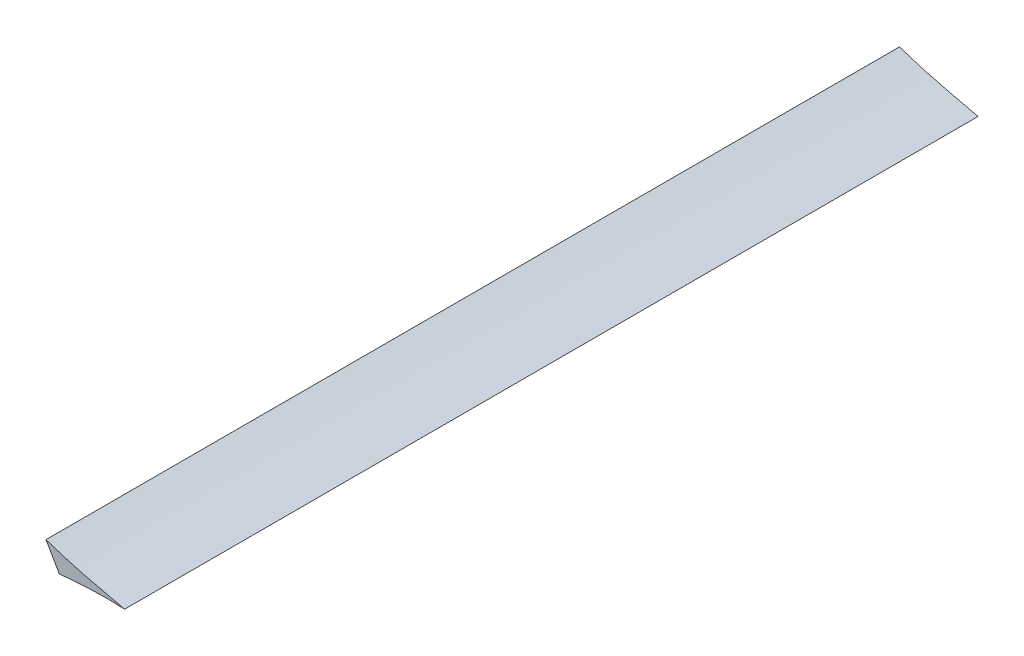
ISO-10303-21;
HEADER;
FILE_DESCRIPTION(('STEP AP214'),'2;1');
FILE_NAME('part.step','',(''),(''),'','','');
FILE_SCHEMA(('AUTOMOTIVE_DESIGN { 1 0 10303 214 1 1 1 1 }'));
ENDSEC;
DATA;
#1=APPLICATION_CONTEXT('core data for automotive mechanical design processes');
#2=APPLICATION_PROTOCOL_DEFINITION('international standard','automotive_design',2000,#1);
#3=PRODUCT_CONTEXT('',#1,'mechanical');
#4=PRODUCT('Part','Part','',(#3));
#5=PRODUCT_RELATED_PRODUCT_CATEGORY('part','',(#4));
#6=PRODUCT_DEFINITION_FORMATION('','',#4);
#7=PRODUCT_DEFINITION_CONTEXT('part definition',#1,'design');
#8=PRODUCT_DEFINITION('design','',#6,#7);
#9=PRODUCT_DEFINITION_SHAPE('','',#8);
#10=(LENGTH_UNIT() NAMED_UNIT(*) SI_UNIT(.MILLI.,.METRE.));
#11=(NAMED_UNIT(*) PLANE_ANGLE_UNIT() SI_UNIT($,.RADIAN.));
#12=(NAMED_UNIT(*) SI_UNIT($,.STERADIAN.) SOLID_ANGLE_UNIT());
#13=UNCERTAINTY_MEASURE_WITH_UNIT(LENGTH_MEASURE(1.E-05),#10,'distance_accuracy_value','');
#14=(GEOMETRIC_REPRESENTATION_CONTEXT(3) GLOBAL_UNCERTAINTY_ASSIGNED_CONTEXT((#13)) GLOBAL_UNIT_ASSIGNED_CONTEXT((#10,
#11,#12)) REPRESENTATION_CONTEXT('',''));
#15=CARTESIAN_POINT('',(0.,0.,0.));
#16=DIRECTION('',(0.,0.,1.));
#17=DIRECTION('',(1.,0.,0.));
#18=AXIS2_PLACEMENT_3D('',#15,#16,#17);
#19=CARTESIAN_POINT('',(0.,0.,225.));
#20=DIRECTION('',(0.,0.,1.));
#21=DIRECTION('',(1.,0.,0.));
#22=AXIS2_PLACEMENT_3D('',#19,#20,#21);
#23=PLANE('',#22);
#24=DIRECTION('',(0.499999999999995,-0.866025403784441,0.));
#25=VECTOR('',#24,1.);
#26=CARTESIAN_POINT('',(0.,6.45575704802336,225.));
#27=LINE('',#26,#25);
#28=CARTESIAN_POINT('',(0.,6.45575704802336,225.));
#29=VERTEX_POINT('',#28);
#30=CARTESIAN_POINT('',(3.50923831572054,0.377577989327863,225.));
#31=VERTEX_POINT('',#30);
#32=EDGE_CURVE('E52',#29,#31,#27,.T.);
#33=ORIENTED_EDGE('',*,*,#32,.F.);
#34=CARTESIAN_POINT('',(0.,0.,225.));
#35=CARTESIAN_POINT('',(0.143412686196248,0.016484913222827,225.));
#36=CARTESIAN_POINT('',(1.15599960637253,0.132169735232295,225.));
#37=CARTESIAN_POINT('',(2.20163152350003,0.245208217831339,225.));
#38=CARTESIAN_POINT('',(3.89642344180233,0.417340987119671,225.));
#39=CARTESIAN_POINT('',(4.75028727163423,0.498881267362469,225.));
#40=CARTESIAN_POINT('',(6.31461532335757,0.638348705882595,225.));
#41=CARTESIAN_POINT('',(7.1134768087235,0.704735468830722,225.));
#42=CARTESIAN_POINT('',(9.23243126054033,0.859157935634537,225.));
#43=CARTESIAN_POINT('',(10.6247063703936,0.935019609344665,225.));
#44=CARTESIAN_POINT('',(13.1229224374773,1.02816862060855,225.));
#45=CARTESIAN_POINT('',(14.2772598862957,1.05499027819146,225.));
#46=CARTESIAN_POINT('',(16.2290326857059,1.06953653121696,225.));
#47=CARTESIAN_POINT('',(17.0679399087013,1.06516197421244,225.));
#48=CARTESIAN_POINT('',(18.5748228619127,1.01721403613804,225.));
#49=CARTESIAN_POINT('',(19.2232515938076,0.986329802867523,225.));
#50=CARTESIAN_POINT('',(19.9647178327966,0.960926398622565,225.));
#51=CARTESIAN_POINT('',(20.1796426531521,0.955940474552006,225.));
#52=CARTESIAN_POINT('',(20.655932980956,0.922497650491091,225.));
#53=CARTESIAN_POINT('',(20.7683006143626,0.914396094678396,225.));
#54=CARTESIAN_POINT('',(20.6569168369895,0.938116524007671,225.));
#55=CARTESIAN_POINT('',(20.1716596740282,1.04349399864364,225.));
#56=CARTESIAN_POINT('',(19.9629663201964,1.10730144475082,225.));
#57=CARTESIAN_POINT('',(19.2301030709278,1.29991618176798,225.));
#58=CARTESIAN_POINT('',(18.579400137475,1.43689519078576,225.));
#59=CARTESIAN_POINT('',(17.064716887785,1.76430761965408,225.));
#60=CARTESIAN_POINT('',(16.2324187321515,1.95231091070916,225.));
#61=CARTESIAN_POINT('',(14.2778493461158,2.40356106670217,225.));
#62=CARTESIAN_POINT('',(13.1319193012487,2.67529946752668,225.));
#63=CARTESIAN_POINT('',(10.6235386488716,3.29081179250831,225.));
#64=CARTESIAN_POINT('',(9.24645056613313,3.6428334080049,225.));
#65=CARTESIAN_POINT('',(7.1171239213485,4.22396769928197,225.));
#66=CARTESIAN_POINT('',(6.33930323187018,4.44388241635937,225.));
#67=CARTESIAN_POINT('',(4.74987453359054,4.91290925443052,225.));
#68=CARTESIAN_POINT('',(3.05098286967538,5.43724376992468,225.));
#69=CARTESIAN_POINT('',(1.19982173982428,6.04772055569866,225.));
#70=CARTESIAN_POINT('',(0.168184003398421,6.39834523666102,225.));
#71=CARTESIAN_POINT('',(0.,6.45575704802336,225.));
#72=B_SPLINE_CURVE_WITH_KNOTS('',3,(#34,#35,#36,#37,#38,#39,#40,#41,#42,#43,#44,#45,#46,#47,#48,
#49,#50,#51,#52,#53,#54,#55,#56,#57,#58,#59,#60,#61,#62,#63,#64,#65,#66,#67,#68,#69,#70,#71),
.UNSPECIFIED.,.F.,.F.,(4,1,1,1,1,1,1,1,1,1,1,1,1,1,1,1,1,1,1,1,1,1,1,1,1,1,1,1,1,1,1,1,1,1,1,4),
(0.902429257890712,0.904464746292487,0.916799996916852,0.917258637759909,0.928486820557414,
0.928896231246836,0.939398012811482,0.939782451634662,0.958876519866814,0.959120139990651,
0.974883075914782,0.974987280763176,0.987050364706602,0.987125023612546,0.995254457623719,
0.995335095931589,0.999480576022632,0.999487806596392,1.,1.00052795687596,1.00053512169122,
1.00480669236207,1.00487594794478,1.01322439420952,1.01326482532404,1.02567252891684,
1.02569607156447,1.0419901069827,1.04209876043517,1.06195341422961,1.06210055225783,
1.0732482814661,1.07334331413919,1.08546199299339,1.09832036515421,1.10082631435623),.UNSPECIFIED.);
#73=EDGE_CURVE('E11',#31,#29,#72,.T.);
#74=ORIENTED_EDGE('',*,*,#73,.F.);
#75=EDGE_LOOP('',(#33,#74));
#76=FACE_BOUND('',#75,.T.);
#77=ADVANCED_FACE('F43',(#76),#23,.F.);
#78=CARTESIAN_POINT('',(20.3113978002213,1.0163144752409,450.));
#79=DIRECTION('',(0.,0.,1.));
#80=DIRECTION('',(1.,0.,0.));
#81=AXIS2_PLACEMENT_3D('',#78,#79,#80);
#82=PLANE('',#81);
#83=DIRECTION('',(0.499999999999995,-0.866025403784441,0.));
#84=VECTOR('',#83,1.);
#85=CARTESIAN_POINT('',(0.,6.45575704802336,450.));
#86=LINE('',#85,#84);
#87=CARTESIAN_POINT('',(0.,6.45575704802336,450.));
#88=VERTEX_POINT('',#87);
#89=CARTESIAN_POINT('',(3.50921677336624,0.377615291498843,450.));
#90=VERTEX_POINT('',#89);
#91=EDGE_CURVE('E70',#88,#90,#86,.T.);
#92=ORIENTED_EDGE('',*,*,#91,.T.);
#93=CARTESIAN_POINT('',(0.,6.45575704802336,450.));
#94=CARTESIAN_POINT('',(0.168184003398421,6.39834523666102,450.));
#95=CARTESIAN_POINT('',(1.19982173982428,6.04772055569866,450.));
#96=CARTESIAN_POINT('',(3.05098286967538,5.43724376992468,450.));
#97=CARTESIAN_POINT('',(4.74987453359054,4.91290925443052,450.));
#98=CARTESIAN_POINT('',(6.33930323187018,4.44388241635937,450.));
#99=CARTESIAN_POINT('',(7.1171239213485,4.22396769928197,450.));
#100=CARTESIAN_POINT('',(9.24645056613313,3.6428334080049,450.));
#101=CARTESIAN_POINT('',(10.6235386488716,3.29081179250831,450.));
#102=CARTESIAN_POINT('',(13.1319193012487,2.67529946752668,450.));
#103=CARTESIAN_POINT('',(14.2778493461158,2.40356106670217,450.));
#104=CARTESIAN_POINT('',(16.2324187321515,1.95231091070916,450.));
#105=CARTESIAN_POINT('',(17.064716887785,1.76430761965408,450.));
#106=CARTESIAN_POINT('',(18.579400137475,1.43689519078576,450.));
#107=CARTESIAN_POINT('',(19.2301030709278,1.29991618176798,450.));
#108=CARTESIAN_POINT('',(19.9629663201964,1.10730144475082,450.));
#109=CARTESIAN_POINT('',(20.1716596740282,1.04349399864364,450.));
#110=CARTESIAN_POINT('',(20.6569168369895,0.938116524007671,450.));
#111=CARTESIAN_POINT('',(20.7683006143626,0.914396094678396,450.));
#112=CARTESIAN_POINT('',(20.655932980956,0.922497650491091,450.));
#113=CARTESIAN_POINT('',(20.1796426531521,0.955940474552006,450.));
#114=CARTESIAN_POINT('',(19.9647178327966,0.960926398622565,450.));
#115=CARTESIAN_POINT('',(19.2232515938076,0.986329802867523,450.));
#116=CARTESIAN_POINT('',(18.5748228619127,1.01721403613804,450.));
#117=CARTESIAN_POINT('',(17.0679399087013,1.06516197421244,450.));
#118=CARTESIAN_POINT('',(16.2290326857059,1.06953653121696,450.));
#119=CARTESIAN_POINT('',(14.2772598862957,1.05499027819146,450.));
#120=CARTESIAN_POINT('',(13.1229224374773,1.02816862060855,450.));
#121=CARTESIAN_POINT('',(10.6247063703936,0.935019609344665,450.));
#122=CARTESIAN_POINT('',(9.23243126054033,0.859157935634537,450.));
#123=CARTESIAN_POINT('',(7.1134768087235,0.704735468830722,450.));
#124=CARTESIAN_POINT('',(6.31461532335757,0.638348705882595,450.));
#125=CARTESIAN_POINT('',(4.87466317995826,0.509969983267332,450.));
#126=CARTESIAN_POINT('',(4.17732595515628,0.444046668521199,450.));
#127=CARTESIAN_POINT('',(3.50922065936546,0.377576232680955,450.));
#128=B_SPLINE_CURVE_WITH_KNOTS('',3,(#93,#94,#95,#96,#97,#98,#99,#100,#101,#102,#103,#104,#105,
#106,#107,#108,#109,#110,#111,#112,#113,#114,#115,#116,#117,#118,#119,#120,#121,#122,#123,#124,
#125,#126,#127),.UNSPECIFIED.,.F.,.F.,(4,1,1,1,1,1,1,1,1,1,1,1,1,1,1,1,1,1,1,1,1,1,1,1,1,1,1,1,
1,1,1,1,4),(0.91901888547696,0.921524834678983,0.934383206839795,0.946501885694002,
0.946596918367094,0.957744647575356,0.95789178560358,0.977746439398021,0.977855092850488,
0.994149128268717,0.994172670916348,1.00658037450915,1.00662080562367,1.01496925188841,
1.01503850747112,1.01931007814197,1.01931724295723,1.01984519983319,1.0203573932368,
1.02036462381056,1.0245101039016,1.02459074220947,1.03272017622064,1.03279483512659,
1.04485791907001,1.04496212391841,1.06072505984254,1.06096867996638,1.08006274819853,
1.08044718702171,1.09094896858635,1.09135837927578,1.10082631435623),.UNSPECIFIED.);
#129=EDGE_CURVE('E78',#90,#88,#128,.F.);
#130=ORIENTED_EDGE('',*,*,#129,.T.);
#131=EDGE_LOOP('',(#92,#130));
#132=FACE_BOUND('',#131,.T.);
#133=ADVANCED_FACE('F80',(#132),#82,.T.);
#134=CARTESIAN_POINT('',(0.,0.,450.));
#135=CARTESIAN_POINT('',(0.143412686196248,0.016484913222827,450.));
#136=CARTESIAN_POINT('',(1.15599960637253,0.132169735232295,450.));
#137=CARTESIAN_POINT('',(2.20163152350003,0.245208217831339,450.));
#138=CARTESIAN_POINT('',(3.89642344180233,0.417340987119671,450.));
#139=CARTESIAN_POINT('',(4.75028727163423,0.498881267362469,450.));
#140=CARTESIAN_POINT('',(6.31461532335757,0.638348705882595,450.));
#141=CARTESIAN_POINT('',(7.1134768087235,0.704735468830722,450.));
#142=CARTESIAN_POINT('',(9.23243126054033,0.859157935634537,450.));
#143=CARTESIAN_POINT('',(10.6247063703936,0.935019609344665,450.));
#144=CARTESIAN_POINT('',(13.1229224374773,1.02816862060855,450.));
#145=CARTESIAN_POINT('',(14.2772598862957,1.05499027819146,450.));
#146=CARTESIAN_POINT('',(16.2290326857059,1.06953653121696,450.));
#147=CARTESIAN_POINT('',(17.0679399087013,1.06516197421244,450.));
#148=CARTESIAN_POINT('',(18.5748228619127,1.01721403613804,450.));
#149=CARTESIAN_POINT('',(19.2232515938076,0.986329802867523,450.));
#150=CARTESIAN_POINT('',(19.9647178327966,0.960926398622565,450.));
#151=CARTESIAN_POINT('',(20.1796426531521,0.955940474552006,450.));
#152=CARTESIAN_POINT('',(20.655932980956,0.922497650491091,450.));
#153=CARTESIAN_POINT('',(20.7683006143626,0.914396094678396,450.));
#154=CARTESIAN_POINT('',(20.6569168369895,0.938116524007671,450.));
#155=CARTESIAN_POINT('',(20.1716596740282,1.04349399864364,450.));
#156=CARTESIAN_POINT('',(19.9629663201964,1.10730144475082,450.));
#157=CARTESIAN_POINT('',(19.2301030709278,1.29991618176798,450.));
#158=CARTESIAN_POINT('',(18.579400137475,1.43689519078576,450.));
#159=CARTESIAN_POINT('',(17.064716887785,1.76430761965408,450.));
#160=CARTESIAN_POINT('',(16.2324187321515,1.95231091070916,450.));
#161=CARTESIAN_POINT('',(14.2778493461158,2.40356106670217,450.));
#162=CARTESIAN_POINT('',(13.1319193012487,2.67529946752668,450.));
#163=CARTESIAN_POINT('',(10.6235386488716,3.29081179250831,450.));
#164=CARTESIAN_POINT('',(9.24645056613313,3.6428334080049,450.));
#165=CARTESIAN_POINT('',(7.1171239213485,4.22396769928197,450.));
#166=CARTESIAN_POINT('',(6.33930323187018,4.44388241635937,450.));
#167=CARTESIAN_POINT('',(4.74987453359054,4.91290925443052,450.));
#168=CARTESIAN_POINT('',(3.05098286967538,5.43724376992468,450.));
#169=CARTESIAN_POINT('',(1.19982173982428,6.04772055569866,450.));
#170=CARTESIAN_POINT('',(0.168184003398421,6.39834523666102,450.));
#171=CARTESIAN_POINT('',(0.,6.45575704802336,450.));
#172=B_SPLINE_CURVE_WITH_KNOTS('',3,(#134,#135,#136,#137,#138,#139,#140,#141,#142,#143,#144,
#145,#146,#147,#148,#149,#150,#151,#152,#153,#154,#155,#156,#157,#158,#159,#160,#161,#162,#163,
#164,#165,#166,#167,#168,#169,#170,#171),.UNSPECIFIED.,.F.,.F.,(4,1,1,1,1,1,1,1,1,1,1,1,1,1,1,1,
1,1,1,1,1,1,1,1,1,1,1,1,1,1,1,1,1,1,1,4),(0.902429257890712,0.904464746292487,0.916799996916852,
0.917258637759909,0.928486820557414,0.928896231246836,0.939398012811482,0.939782451634662,
0.958876519866814,0.959120139990651,0.974883075914782,0.974987280763176,0.987050364706602,
0.987125023612546,0.995254457623719,0.995335095931589,0.999480576022632,0.999487806596392,1.,
1.00052795687596,1.00053512169122,1.00480669236207,1.00487594794478,1.01322439420952,
1.01326482532404,1.02567252891684,1.02569607156447,1.0419901069827,1.04209876043517,
1.06195341422961,1.06210055225783,1.0732482814661,1.07334331413919,1.08546199299339,
1.09832036515421,1.10082631435623),.UNSPECIFIED.);
#173=DIRECTION('',(0.,0.,-1.));
#174=VECTOR('',#173,1.);
#175=SURFACE_OF_LINEAR_EXTRUSION('',#172,#174);
#176=DIRECTION('',(0.,0.,-1.));
#177=VECTOR('',#176,1.);
#178=CARTESIAN_POINT('',(3.50923831572054,0.377577989327863,450.));
#179=LINE('',#178,#177);
#180=EDGE_CURVE('E74',#90,#31,#179,.T.);
#181=ORIENTED_EDGE('',*,*,#180,.T.);
#182=ORIENTED_EDGE('',*,*,#73,.T.);
#183=DIRECTION('',(0.,0.,-1.));
#184=VECTOR('',#183,1.);
#185=CARTESIAN_POINT('',(0.,6.45575704802336,450.));
#186=LINE('',#185,#184);
#187=EDGE_CURVE('E73',#88,#29,#186,.T.);
#188=ORIENTED_EDGE('',*,*,#187,.F.);
#189=ORIENTED_EDGE('',*,*,#129,.F.);
#190=EDGE_LOOP('',(#181,#182,#188,#189));
#191=FACE_BOUND('',#190,.T.);
#192=ADVANCED_FACE('F84',(#191),#175,.F.);
#193=CARTESIAN_POINT('',(0.,6.45575704802336,450.));
#194=DIRECTION('',(0.866025403784441,0.499999999999995,0.));
#195=DIRECTION('',(-0.499999999999995,0.866025403784441,0.));
#196=AXIS2_PLACEMENT_3D('',#193,#194,#195);
#197=PLANE('',#196);
#198=ORIENTED_EDGE('',*,*,#187,.T.);
#199=ORIENTED_EDGE('',*,*,#32,.T.);
#200=ORIENTED_EDGE('',*,*,#180,.F.);
#201=ORIENTED_EDGE('',*,*,#91,.F.);
#202=EDGE_LOOP('',(#198,#199,#200,#201));
#203=FACE_BOUND('',#202,.T.);
#204=ADVANCED_FACE('F72',(#203),#197,.F.);
#205=CLOSED_SHELL('',(#77,#133,#192,#204));
#206=MANIFOLD_SOLID_BREP('B2',#205);
#207=ADVANCED_BREP_SHAPE_REPRESENTATION('',(#18,#206),#14);
#208=SHAPE_DEFINITION_REPRESENTATION(#9,#207);
ENDSEC;
END-ISO-10303-21;
